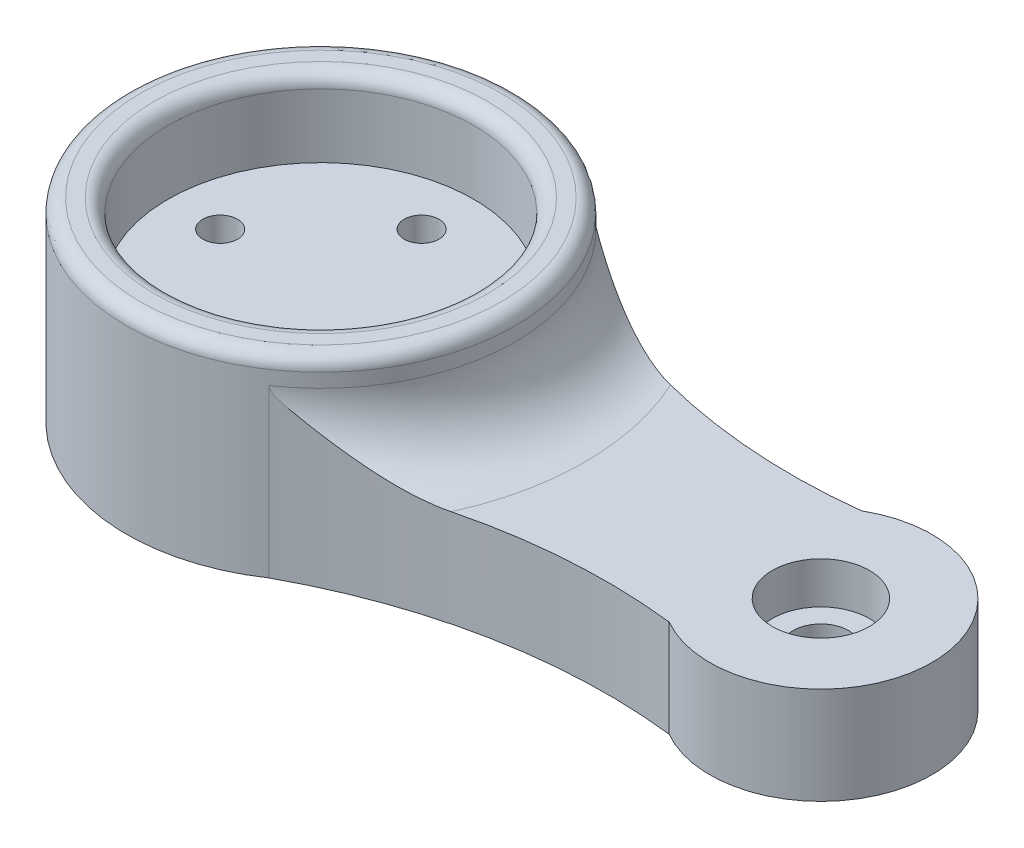
ISO-10303-21;
HEADER;
FILE_DESCRIPTION(('STEP AP214'),'2;1');
FILE_NAME('part.step','',(''),(''),'','','');
FILE_SCHEMA(('AUTOMOTIVE_DESIGN { 1 0 10303 214 1 1 1 1 }'));
ENDSEC;
DATA;
#1=APPLICATION_CONTEXT('core data for automotive mechanical design processes');
#2=APPLICATION_PROTOCOL_DEFINITION('international standard','automotive_design',2000,#1);
#3=PRODUCT_CONTEXT('',#1,'mechanical');
#4=PRODUCT('Part','Part','',(#3));
#5=PRODUCT_RELATED_PRODUCT_CATEGORY('part','',(#4));
#6=PRODUCT_DEFINITION_FORMATION('','',#4);
#7=PRODUCT_DEFINITION_CONTEXT('part definition',#1,'design');
#8=PRODUCT_DEFINITION('design','',#6,#7);
#9=PRODUCT_DEFINITION_SHAPE('','',#8);
#10=(LENGTH_UNIT() NAMED_UNIT(*) SI_UNIT(.MILLI.,.METRE.));
#11=(NAMED_UNIT(*) PLANE_ANGLE_UNIT() SI_UNIT($,.RADIAN.));
#12=(NAMED_UNIT(*) SI_UNIT($,.STERADIAN.) SOLID_ANGLE_UNIT());
#13=UNCERTAINTY_MEASURE_WITH_UNIT(LENGTH_MEASURE(1.E-05),#10,'distance_accuracy_value','');
#14=(GEOMETRIC_REPRESENTATION_CONTEXT(3) GLOBAL_UNCERTAINTY_ASSIGNED_CONTEXT((#13)) GLOBAL_UNIT_ASSIGNED_CONTEXT((#10,
#11,#12)) REPRESENTATION_CONTEXT('',''));
#15=CARTESIAN_POINT('',(0.,0.,0.));
#16=DIRECTION('',(0.,0.,1.));
#17=DIRECTION('',(1.,0.,0.));
#18=AXIS2_PLACEMENT_3D('',#15,#16,#17);
#19=CARTESIAN_POINT('',(36.,7.,0.));
#20=DIRECTION('',(0.,-1.,0.));
#21=DIRECTION('',(0.,0.,-1.));
#22=AXIS2_PLACEMENT_3D('',#19,#20,#21);
#23=CYLINDRICAL_SURFACE('',#22,2.);
#24=CARTESIAN_POINT('',(36.,0.,0.));
#25=DIRECTION('',(0.,1.,0.));
#26=DIRECTION('',(0.,0.,1.));
#27=AXIS2_PLACEMENT_3D('',#24,#25,#26);
#28=CIRCLE('',#27,2.);
#29=CARTESIAN_POINT('',(36.,0.,2.));
#30=VERTEX_POINT('',#29);
#31=EDGE_CURVE('E254',#30,#30,#28,.T.);
#32=ORIENTED_EDGE('',*,*,#31,.F.);
#33=EDGE_LOOP('',(#32));
#34=FACE_BOUND('',#33,.T.);
#35=CARTESIAN_POINT('',(36.,4.,0.));
#36=DIRECTION('',(0.,1.,0.));
#37=DIRECTION('',(0.,0.,1.));
#38=AXIS2_PLACEMENT_3D('',#35,#36,#37);
#39=CIRCLE('',#38,2.);
#40=CARTESIAN_POINT('',(36.,4.,2.));
#41=VERTEX_POINT('',#40);
#42=EDGE_CURVE('E42',#41,#41,#39,.T.);
#43=ORIENTED_EDGE('',*,*,#42,.T.);
#44=EDGE_LOOP('',(#43));
#45=FACE_BOUND('',#44,.T.);
#46=ADVANCED_FACE('F38',(#34,#45),#23,.F.);
#47=CARTESIAN_POINT('',(0.,14.,0.));
#48=DIRECTION('',(0.,-1.,0.));
#49=DIRECTION('',(0.,0.,-1.));
#50=AXIS2_PLACEMENT_3D('',#47,#48,#49);
#51=CYLINDRICAL_SURFACE('',#50,14.);
#52=CARTESIAN_POINT('',(0.,13.,0.));
#53=DIRECTION('',(0.,1.,0.));
#54=DIRECTION('',(0.,0.,1.));
#55=AXIS2_PLACEMENT_3D('',#52,#53,#54);
#56=CIRCLE('',#55,14.);
#57=CARTESIAN_POINT('',(0.,13.,14.));
#58=VERTEX_POINT('',#57);
#59=EDGE_CURVE('E11',#58,#58,#56,.F.);
#60=ORIENTED_EDGE('',*,*,#59,.T.);
#61=EDGE_LOOP('',(#60));
#62=FACE_BOUND('',#61,.T.);
#63=CARTESIAN_POINT('',(0.,12.,0.));
#64=DIRECTION('',(0.,1.,0.));
#65=DIRECTION('',(0.,0.,1.));
#66=AXIS2_PLACEMENT_3D('',#63,#64,#65);
#67=CIRCLE('',#66,14.);
#68=CARTESIAN_POINT('',(7.84985565433126,12.,11.592228698838));
#69=VERTEX_POINT('',#68);
#70=CARTESIAN_POINT('',(7.84985565433126,12.,-11.592228698838));
#71=VERTEX_POINT('',#70);
#72=EDGE_CURVE('E107',#69,#71,#67,.T.);
#73=ORIENTED_EDGE('',*,*,#72,.T.);
#74=DIRECTION('',(0.,-1.,0.));
#75=VECTOR('',#74,1.);
#76=CARTESIAN_POINT('',(7.84985565433126,7.,-11.592228698838));
#77=LINE('',#76,#75);
#78=CARTESIAN_POINT('',(7.84985565433126,0.,-11.592228698838));
#79=VERTEX_POINT('',#78);
#80=EDGE_CURVE('E105',#71,#79,#77,.T.);
#81=ORIENTED_EDGE('',*,*,#80,.T.);
#82=CARTESIAN_POINT('',(0.,0.,0.));
#83=DIRECTION('',(0.,1.,0.));
#84=DIRECTION('',(0.,0.,1.));
#85=AXIS2_PLACEMENT_3D('',#82,#83,#84);
#86=CIRCLE('',#85,14.);
#87=CARTESIAN_POINT('',(7.84985565433126,0.,11.592228698838));
#88=VERTEX_POINT('',#87);
#89=EDGE_CURVE('E104',#79,#88,#86,.T.);
#90=ORIENTED_EDGE('',*,*,#89,.T.);
#91=DIRECTION('',(0.,-1.,0.));
#92=VECTOR('',#91,1.);
#93=CARTESIAN_POINT('',(7.84985565433126,7.,11.592228698838));
#94=LINE('',#93,#92);
#95=EDGE_CURVE('E110',#69,#88,#94,.T.);
#96=ORIENTED_EDGE('',*,*,#95,.F.);
#97=EDGE_LOOP('',(#73,#81,#90,#96));
#98=FACE_BOUND('',#97,.T.);
#99=ADVANCED_FACE('F145',(#62,#98),#51,.T.);
#100=CARTESIAN_POINT('',(0.,14.,0.));
#101=DIRECTION('',(0.,1.,0.));
#102=DIRECTION('',(0.,0.,1.));
#103=AXIS2_PLACEMENT_3D('',#100,#101,#102);
#104=PLANE('',#103);
#105=CARTESIAN_POINT('',(0.,14.,0.));
#106=DIRECTION('',(0.,1.,0.));
#107=DIRECTION('',(0.,0.,1.));
#108=AXIS2_PLACEMENT_3D('',#105,#106,#107);
#109=CIRCLE('',#108,12.);
#110=CARTESIAN_POINT('',(0.,14.,12.));
#111=VERTEX_POINT('',#110);
#112=EDGE_CURVE('E47',#111,#111,#109,.F.);
#113=ORIENTED_EDGE('',*,*,#112,.T.);
#114=EDGE_LOOP('',(#113));
#115=FACE_BOUND('',#114,.T.);
#116=CARTESIAN_POINT('',(0.,14.,0.));
#117=DIRECTION('',(0.,1.,0.));
#118=DIRECTION('',(0.,0.,1.));
#119=AXIS2_PLACEMENT_3D('',#116,#117,#118);
#120=CIRCLE('',#119,13.);
#121=CARTESIAN_POINT('',(0.,14.,13.));
#122=VERTEX_POINT('',#121);
#123=EDGE_CURVE('E167',#122,#122,#120,.T.);
#124=ORIENTED_EDGE('',*,*,#123,.T.);
#125=EDGE_LOOP('',(#124));
#126=FACE_BOUND('',#125,.T.);
#127=ADVANCED_FACE('F147',(#115,#126),#104,.T.);
#128=CARTESIAN_POINT('',(0.,0.,0.));
#129=DIRECTION('',(0.,1.,0.));
#130=DIRECTION('',(0.,0.,1.));
#131=AXIS2_PLACEMENT_3D('',#128,#129,#130);
#132=PLANE('',#131);
#133=CARTESIAN_POINT('',(0.,0.,-7.25));
#134=DIRECTION('',(0.,1.,0.));
#135=DIRECTION('',(0.,0.,1.));
#136=AXIS2_PLACEMENT_3D('',#133,#134,#135);
#137=CIRCLE('',#136,1.25);
#138=CARTESIAN_POINT('',(0.,0.,-6.));
#139=VERTEX_POINT('',#138);
#140=EDGE_CURVE('E249',#139,#139,#137,.T.);
#141=ORIENTED_EDGE('',*,*,#140,.T.);
#142=EDGE_LOOP('',(#141));
#143=FACE_BOUND('',#142,.T.);
#144=CARTESIAN_POINT('',(7.2500000000002,0.,-2.04725589976356E-13));
#145=DIRECTION('',(0.,1.,0.));
#146=DIRECTION('',(0.,0.,1.));
#147=AXIS2_PLACEMENT_3D('',#144,#145,#146);
#148=CIRCLE('',#147,1.25000000000016);
#149=CARTESIAN_POINT('',(7.2500000000002,0.,1.24999999999996));
#150=VERTEX_POINT('',#149);
#151=EDGE_CURVE('E246',#150,#150,#148,.T.);
#152=ORIENTED_EDGE('',*,*,#151,.T.);
#153=EDGE_LOOP('',(#152));
#154=FACE_BOUND('',#153,.T.);
#155=CARTESIAN_POINT('',(4.09451179952713E-13,0.,7.25));
#156=DIRECTION('',(0.,1.,0.));
#157=DIRECTION('',(0.,0.,1.));
#158=AXIS2_PLACEMENT_3D('',#155,#156,#157);
#159=CIRCLE('',#158,1.25000000000044);
#160=CARTESIAN_POINT('',(4.09451179952713E-13,0.,8.50000000000044));
#161=VERTEX_POINT('',#160);
#162=EDGE_CURVE('E243',#161,#161,#159,.T.);
#163=ORIENTED_EDGE('',*,*,#162,.T.);
#164=EDGE_LOOP('',(#163));
#165=FACE_BOUND('',#164,.T.);
#166=CARTESIAN_POINT('',(-7.2499999999998,0.,2.05613458905738E-13));
#167=DIRECTION('',(0.,1.,0.));
#168=DIRECTION('',(0.,0.,1.));
#169=AXIS2_PLACEMENT_3D('',#166,#167,#168);
#170=CIRCLE('',#169,1.25000000000033);
#171=CARTESIAN_POINT('',(-7.2499999999998,0.,1.25000000000054));
#172=VERTEX_POINT('',#171);
#173=EDGE_CURVE('E231',#172,#172,#170,.T.);
#174=ORIENTED_EDGE('',*,*,#173,.T.);
#175=EDGE_LOOP('',(#174));
#176=FACE_BOUND('',#175,.T.);
#177=ORIENTED_EDGE('',*,*,#89,.F.);
#178=CARTESIAN_POINT('',(27.2681035881496,0.,-47.2917340375686));
#179=DIRECTION('',(0.,1.,0.));
#180=DIRECTION('',(0.,0.,1.));
#181=AXIS2_PLACEMENT_3D('',#178,#179,#180);
#182=CIRCLE('',#181,40.6389349546626);
#183=CARTESIAN_POINT('',(32.0022203720833,0.,-6.92948468838873));
#184=VERTEX_POINT('',#183);
#185=EDGE_CURVE('E261',#79,#184,#182,.T.);
#186=ORIENTED_EDGE('',*,*,#185,.T.);
#187=CARTESIAN_POINT('',(36.,0.,0.));
#188=DIRECTION('',(0.,1.,0.));
#189=DIRECTION('',(0.,0.,1.));
#190=AXIS2_PLACEMENT_3D('',#187,#188,#189);
#191=CIRCLE('',#190,8.);
#192=CARTESIAN_POINT('',(32.0022203720833,0.,6.92948468838873));
#193=VERTEX_POINT('',#192);
#194=EDGE_CURVE('E102',#193,#184,#191,.T.);
#195=ORIENTED_EDGE('',*,*,#194,.F.);
#196=CARTESIAN_POINT('',(27.2681035881496,0.,47.2917340375686));
#197=DIRECTION('',(0.,1.,0.));
#198=DIRECTION('',(0.,0.,1.));
#199=AXIS2_PLACEMENT_3D('',#196,#197,#198);
#200=CIRCLE('',#199,40.6389349546626);
#201=EDGE_CURVE('E98',#88,#193,#200,.F.);
#202=ORIENTED_EDGE('',*,*,#201,.F.);
#203=EDGE_LOOP('',(#177,#186,#195,#202));
#204=FACE_BOUND('',#203,.T.);
#205=ORIENTED_EDGE('',*,*,#31,.T.);
#206=EDGE_LOOP('',(#205));
#207=FACE_BOUND('',#206,.T.);
#208=ADVANCED_FACE('F142',(#143,#154,#165,#176,#204,#207),#132,.F.);
#209=CARTESIAN_POINT('',(36.,7.,0.));
#210=DIRECTION('',(0.,-1.,0.));
#211=DIRECTION('',(0.,0.,-1.));
#212=AXIS2_PLACEMENT_3D('',#209,#210,#211);
#213=CYLINDRICAL_SURFACE('',#212,8.);
#214=ORIENTED_EDGE('',*,*,#194,.T.);
#215=DIRECTION('',(0.,-1.,0.));
#216=VECTOR('',#215,1.);
#217=CARTESIAN_POINT('',(32.0022203720833,7.,-6.92948468838873));
#218=LINE('',#217,#216);
#219=CARTESIAN_POINT('',(32.0022203720833,7.,-6.92948468838873));
#220=VERTEX_POINT('',#219);
#221=EDGE_CURVE('E88',#220,#184,#218,.T.);
#222=ORIENTED_EDGE('',*,*,#221,.F.);
#223=CARTESIAN_POINT('',(36.,7.,0.));
#224=DIRECTION('',(0.,1.,0.));
#225=DIRECTION('',(0.,0.,1.));
#226=AXIS2_PLACEMENT_3D('',#223,#224,#225);
#227=CIRCLE('',#226,8.);
#228=CARTESIAN_POINT('',(32.0022203720833,7.,6.92948468838873));
#229=VERTEX_POINT('',#228);
#230=EDGE_CURVE('E91',#229,#220,#227,.T.);
#231=ORIENTED_EDGE('',*,*,#230,.F.);
#232=DIRECTION('',(0.,-1.,0.));
#233=VECTOR('',#232,1.);
#234=CARTESIAN_POINT('',(32.0022203720833,7.,6.92948468838873));
#235=LINE('',#234,#233);
#236=EDGE_CURVE('E257',#229,#193,#235,.T.);
#237=ORIENTED_EDGE('',*,*,#236,.T.);
#238=EDGE_LOOP('',(#214,#222,#231,#237));
#239=FACE_BOUND('',#238,.T.);
#240=ADVANCED_FACE('F100',(#239),#213,.T.);
#241=CARTESIAN_POINT('',(27.2681035881496,7.,-47.2917340375686));
#242=DIRECTION('',(0.,-1.,0.));
#243=DIRECTION('',(0.,0.,-1.));
#244=AXIS2_PLACEMENT_3D('',#241,#242,#243);
#245=CYLINDRICAL_SURFACE('',#244,40.6389349546626);
#246=ORIENTED_EDGE('',*,*,#185,.F.);
#247=ORIENTED_EDGE('',*,*,#80,.F.);
#248=CARTESIAN_POINT('',(7.84985565433126,12.,-11.592228698838));
#249=CARTESIAN_POINT('',(7.84974022861477,11.9679309176719,-11.5922925865803));
#250=CARTESIAN_POINT('',(7.85265054969314,11.9360773456577,-11.5907083390197));
#251=CARTESIAN_POINT('',(7.86332220076886,11.8740872266933,-11.5849062790627));
#252=CARTESIAN_POINT('',(7.87098266918817,11.8439288512946,-11.5807432252193));
#253=CARTESIAN_POINT('',(7.89484307359123,11.7704549373273,-11.5677916777738));
#254=CARTESIAN_POINT('',(7.91340111185751,11.7281708444863,-11.5577293964526));
#255=CARTESIAN_POINT('',(7.95572152866589,11.6466654603166,-11.5348391802298));
#256=CARTESIAN_POINT('',(7.97954143458571,11.6074850946165,-11.5219807011542));
#257=CARTESIAN_POINT('',(8.05078578916995,11.5009485890175,-11.4836286680165));
#258=CARTESIAN_POINT('',(8.1016505101103,11.436596646532,-11.4563651363081));
#259=CARTESIAN_POINT('',(8.20794625276915,11.3127109121178,-11.3997135139125));
#260=CARTESIAN_POINT('',(8.26339078654471,11.2531924852263,-11.3703191702495));
#261=CARTESIAN_POINT('',(8.37706841297851,11.1370657583194,-11.3104061040382));
#262=CARTESIAN_POINT('',(8.4353096295304,11.0804670680134,-11.2798841737002));
#263=CARTESIAN_POINT('',(8.55339242705564,10.9694673058596,-11.2183774007257));
#264=CARTESIAN_POINT('',(8.61323140460291,10.9150629830675,-11.1873933435915));
#265=CARTESIAN_POINT('',(8.793278481255,10.755242319462,-11.0947462006986));
#266=CARTESIAN_POINT('',(8.91524942267105,10.652015252016,-11.032737554919));
#267=CARTESIAN_POINT('',(9.16231003071952,10.4493353410656,-10.9087375461931));
#268=CARTESIAN_POINT('',(9.28740039371779,10.3498833530194,-10.8467461902869));
#269=CARTESIAN_POINT('',(9.54029337011726,10.1539261092309,-10.7230642111642));
#270=CARTESIAN_POINT('',(9.66809907229333,10.0574245515463,-10.6613740407446));
#271=CARTESIAN_POINT('',(9.92602875230379,9.86724225930931,-10.538558908456));
#272=CARTESIAN_POINT('',(10.0561524946845,9.77356124083322,-10.4774338901292));
#273=CARTESIAN_POINT('',(10.4495008074444,9.49697197712343,-10.2952332338723));
#274=CARTESIAN_POINT('',(10.7161122094876,9.31820120129215,-10.175131199454));
#275=CARTESIAN_POINT('',(11.2583978026474,8.973147762316,-9.93802054242334));
#276=CARTESIAN_POINT('',(11.5340665551478,8.80685779503413,-9.82101013689485));
#277=CARTESIAN_POINT('',(12.0975081176459,8.48774853292849,-9.58935215669122));
#278=CARTESIAN_POINT('',(12.3853618792861,8.33505138023552,-9.47473195758891));
#279=CARTESIAN_POINT('',(12.9716359201195,8.04782479631386,-9.24922203298971));
#280=CARTESIAN_POINT('',(13.2700601117094,7.91330218255468,-9.13833371901126));
#281=CARTESIAN_POINT('',(13.8762341585524,7.66695410840608,-8.92138111237948));
#282=CARTESIAN_POINT('',(14.1839370982046,7.55503119561138,-8.81529770697784));
#283=CARTESIAN_POINT('',(14.8092942634841,7.35780614680489,-8.60828102437342));
#284=CARTESIAN_POINT('',(15.1269409984889,7.27248447905179,-8.50734401423981));
#285=CARTESIAN_POINT('',(15.7473566801688,7.13877404852054,-8.31876525413785));
#286=CARTESIAN_POINT('',(16.049492881318,7.08812381790483,-8.23069209555604));
#287=CARTESIAN_POINT('',(16.6605986056181,7.01867776177677,-8.06029343574112));
#288=CARTESIAN_POINT('',(16.9695950600419,7.00004519317896,-7.97799943202157));
#289=CARTESIAN_POINT('',(17.280067100755,7.,-7.89932155272873));
#290=B_SPLINE_CURVE_WITH_KNOTS('',3,(#248,#249,#250,#251,#252,#253,#254,#255,#256,#257,#258,
#259,#260,#261,#262,#263,#264,#265,#266,#267,#268,#269,#270,#271,#272,#273,#274,#275,#276,#277,
#278,#279,#280,#281,#282,#283,#284,#285,#286,#287,#288,#289),.UNSPECIFIED.,.F.,.F.,(4,2,2,2,2,2,
2,2,2,2,2,2,2,2,2,2,2,2,2,2,4),(0.,0.0956940712966536,0.189422701596269,0.330401138202287,
0.473004715475644,0.731601544597679,0.99099061924358,1.25118509277208,1.5109787586279,
2.02504819054163,2.53923342691654,3.05403871454739,3.56879200594802,4.59663422428038,
5.62387015127668,6.65956119297143,7.6956396614654,8.72715026811531,9.75790170331909,
10.7125617105111,11.6720752079897),.UNSPECIFIED.);
#291=CARTESIAN_POINT('',(17.280067100755,7.,-7.89932155272873));
#292=VERTEX_POINT('',#291);
#293=EDGE_CURVE('E62',#71,#292,#290,.T.);
#294=ORIENTED_EDGE('',*,*,#293,.T.);
#295=CARTESIAN_POINT('',(27.2681035881496,7.,-47.2917340375686));
#296=DIRECTION('',(0.,1.,0.));
#297=DIRECTION('',(0.,0.,1.));
#298=AXIS2_PLACEMENT_3D('',#295,#296,#297);
#299=CIRCLE('',#298,40.6389349546626);
#300=EDGE_CURVE('E83',#292,#220,#299,.T.);
#301=ORIENTED_EDGE('',*,*,#300,.T.);
#302=ORIENTED_EDGE('',*,*,#221,.T.);
#303=EDGE_LOOP('',(#246,#247,#294,#301,#302));
#304=FACE_BOUND('',#303,.T.);
#305=ADVANCED_FACE('F86',(#304),#245,.F.);
#306=CARTESIAN_POINT('',(27.2681035881496,7.,47.2917340375686));
#307=DIRECTION('',(0.,-1.,0.));
#308=DIRECTION('',(0.,0.,-1.));
#309=AXIS2_PLACEMENT_3D('',#306,#307,#308);
#310=CYLINDRICAL_SURFACE('',#309,40.6389349546626);
#311=ORIENTED_EDGE('',*,*,#201,.T.);
#312=ORIENTED_EDGE('',*,*,#236,.F.);
#313=CARTESIAN_POINT('',(27.2681035881496,7.,47.2917340375686));
#314=DIRECTION('',(0.,1.,0.));
#315=DIRECTION('',(0.,0.,1.));
#316=AXIS2_PLACEMENT_3D('',#313,#314,#315);
#317=CIRCLE('',#316,40.6389349546626);
#318=CARTESIAN_POINT('',(17.280067100755,7.,7.89932155272873));
#319=VERTEX_POINT('',#318);
#320=EDGE_CURVE('E90',#319,#229,#317,.F.);
#321=ORIENTED_EDGE('',*,*,#320,.F.);
#322=CARTESIAN_POINT('',(17.280067100755,7.,7.89932155272873));
#323=CARTESIAN_POINT('',(17.0174684213055,7.0000181662928,7.96587945108746));
#324=CARTESIAN_POINT('',(16.7558203697529,7.01336673860963,8.0350388996193));
#325=CARTESIAN_POINT('',(16.2365900200022,7.06371356097446,8.17779079874259));
#326=CARTESIAN_POINT('',(15.9790002906786,7.10066171247149,8.25137356022765));
#327=CARTESIAN_POINT('',(15.4716270059155,7.19472105117239,8.40168875069373));
#328=CARTESIAN_POINT('',(15.2217896718571,7.25161457318647,8.47837957365822));
#329=CARTESIAN_POINT('',(14.7277718387462,7.38305851346483,8.6351653576078));
#330=CARTESIAN_POINT('',(14.4835950471418,7.45762016393798,8.7152624573864));
#331=CARTESIAN_POINT('',(13.8330770606024,7.67942347721404,8.93537976543369));
#332=CARTESIAN_POINT('',(13.4325719261037,7.84105799476147,9.07818440882779));
#333=CARTESIAN_POINT('',(12.6497373326556,8.19850263102909,9.37074596706712));
#334=CARTESIAN_POINT('',(12.2674211583646,8.39433725528567,9.52050781011794));
#335=CARTESIAN_POINT('',(11.7060154212405,8.70846296897013,9.74994973724382));
#336=CARTESIAN_POINT('',(11.5204029573492,8.81689034940267,9.82744779724331));
#337=CARTESIAN_POINT('',(11.1533853966746,9.03969281841592,9.98384360908571));
#338=CARTESIAN_POINT('',(10.9719801619727,9.15406771162969,10.0627413148963));
#339=CARTESIAN_POINT('',(10.6133253523219,9.38809696967035,10.2218020259717));
#340=CARTESIAN_POINT('',(10.4360738505015,9.50774880924323,10.3019644144826));
#341=CARTESIAN_POINT('',(10.0855786863905,9.75199866470023,10.463469213148));
#342=CARTESIAN_POINT('',(9.91233477132722,9.87659636727762,10.5448115483498));
#343=CARTESIAN_POINT('',(9.59794489637832,10.1100404445101,10.6950985460404));
#344=CARTESIAN_POINT('',(9.45617462657944,10.2181390171632,10.7639001005864));
#345=CARTESIAN_POINT('',(9.17629508509291,10.4379726154743,10.9017116330813));
#346=CARTESIAN_POINT('',(9.03817678538744,10.5496967757575,10.9707205109406));
#347=CARTESIAN_POINT('',(8.81612679514069,10.736598767069,11.0832142388125));
#348=CARTESIAN_POINT('',(8.73088882574537,10.8101630618612,11.1267838164661));
#349=CARTESIAN_POINT('',(8.56256207501011,10.9606687856993,11.2135583420112));
#350=CARTESIAN_POINT('',(8.47948319692822,11.0376224897469,11.2567611486962));
#351=CARTESIAN_POINT('',(8.31659622191047,11.1970536763272,11.3421607183105));
#352=CARTESIAN_POINT('',(8.23681805504419,11.2795689568296,11.3843472395597));
#353=CARTESIAN_POINT('',(8.12394153504192,11.410396225039,11.4444756365264));
#354=CARTESIAN_POINT('',(8.08751283821482,11.4550862602229,11.4639579620724));
#355=CARTESIAN_POINT('',(8.01845376533322,11.5480000214613,11.5010156673316));
#356=CARTESIAN_POINT('',(7.98581311360491,11.5962135807052,11.5185961967254));
#357=CARTESIAN_POINT('',(7.93884254137544,11.678074597348,11.5439631851053));
#358=CARTESIAN_POINT('',(7.92233163674018,11.7100838906451,11.5528977680977));
#359=CARTESIAN_POINT('',(7.89335631489633,11.7762193985695,11.5685977060913));
#360=CARTESIAN_POINT('',(7.88086515918084,11.8103297474664,11.5753773911299));
#361=CARTESIAN_POINT('',(7.8644631118189,11.8703032953228,11.5842861338451));
#362=CARTESIAN_POINT('',(7.85910930370444,11.8956427524995,11.5871964694578));
#363=CARTESIAN_POINT('',(7.8517504214794,11.9472848447118,11.591198032342));
#364=CARTESIAN_POINT('',(7.84979194125363,11.973595896944,11.5922639483818));
#365=CARTESIAN_POINT('',(7.84985565433125,12.,11.592228698838));
#366=B_SPLINE_CURVE_WITH_KNOTS('',3,(#322,#323,#324,#325,#326,#327,#328,#329,#330,#331,#332,
#333,#334,#335,#336,#337,#338,#339,#340,#341,#342,#343,#344,#345,#346,#347,#348,#349,#350,#351,
#352,#353,#354,#355,#356,#357,#358,#359,#360,#361,#362,#363,#364,#365),.UNSPECIFIED.,.F.,.F.,(4,
2,2,2,2,2,2,2,2,2,2,2,2,2,2,2,2,2,2,2,2,4),(0.,0.811958707503267,1.62219944515059,
2.42385992770422,3.22603142593327,4.58840085741852,5.95175050834504,6.63716710322882,
7.32256119740244,8.00763078532036,8.69265704501786,9.26589104392878,9.83754219758415,
10.1996740603956,10.5632471165878,10.9296052370512,11.1120679655854,11.2940235554311,
11.4051298476166,11.5154810281657,11.5933885715482,11.6723570144176),.UNSPECIFIED.);
#367=EDGE_CURVE('E124',#319,#69,#366,.T.);
#368=ORIENTED_EDGE('',*,*,#367,.T.);
#369=ORIENTED_EDGE('',*,*,#95,.T.);
#370=EDGE_LOOP('',(#311,#312,#321,#368,#369));
#371=FACE_BOUND('',#370,.T.);
#372=ADVANCED_FACE('F137',(#371),#310,.F.);
#373=CARTESIAN_POINT('',(0.,7.,0.));
#374=DIRECTION('',(0.,1.,0.));
#375=DIRECTION('',(0.,0.,1.));
#376=AXIS2_PLACEMENT_3D('',#373,#374,#375);
#377=PLANE('',#376);
#378=CARTESIAN_POINT('',(36.,7.,0.));
#379=DIRECTION('',(0.,1.,0.));
#380=DIRECTION('',(0.,0.,1.));
#381=AXIS2_PLACEMENT_3D('',#378,#379,#380);
#382=CIRCLE('',#381,3.50000000000001);
#383=CARTESIAN_POINT('',(36.,7.,3.50000000000001));
#384=VERTEX_POINT('',#383);
#385=EDGE_CURVE('E222',#384,#384,#382,.T.);
#386=ORIENTED_EDGE('',*,*,#385,.F.);
#387=EDGE_LOOP('',(#386));
#388=FACE_BOUND('',#387,.T.);
#389=ORIENTED_EDGE('',*,*,#300,.F.);
#390=CARTESIAN_POINT('',(0.,7.,0.));
#391=DIRECTION('',(0.,1.,0.));
#392=DIRECTION('',(0.,0.,1.));
#393=AXIS2_PLACEMENT_3D('',#390,#391,#392);
#394=CIRCLE('',#393,19.);
#395=EDGE_CURVE('E54',#292,#319,#394,.F.);
#396=ORIENTED_EDGE('',*,*,#395,.T.);
#397=ORIENTED_EDGE('',*,*,#320,.T.);
#398=ORIENTED_EDGE('',*,*,#230,.T.);
#399=EDGE_LOOP('',(#389,#396,#397,#398));
#400=FACE_BOUND('',#399,.T.);
#401=ADVANCED_FACE('F94',(#388,#400),#377,.T.);
#402=CARTESIAN_POINT('',(0.,12.,0.));
#403=DIRECTION('',(0.,1.,0.));
#404=DIRECTION('',(0.,0.,1.));
#405=AXIS2_PLACEMENT_3D('',#402,#403,#404);
#406=TOROIDAL_SURFACE('',#405,19.,5.);
#407=ORIENTED_EDGE('',*,*,#367,.F.);
#408=ORIENTED_EDGE('',*,*,#395,.F.);
#409=ORIENTED_EDGE('',*,*,#293,.F.);
#410=ORIENTED_EDGE('',*,*,#72,.F.);
#411=EDGE_LOOP('',(#407,#408,#409,#410));
#412=FACE_BOUND('',#411,.T.);
#413=ADVANCED_FACE('F131',(#412),#406,.F.);
#414=CARTESIAN_POINT('',(0.,8.4,0.));
#415=DIRECTION('',(0.,1.,0.));
#416=DIRECTION('',(0.,0.,1.));
#417=AXIS2_PLACEMENT_3D('',#414,#415,#416);
#418=CYLINDRICAL_SURFACE('',#417,11.);
#419=CARTESIAN_POINT('',(0.,13.,0.));
#420=DIRECTION('',(0.,1.,0.));
#421=DIRECTION('',(0.,0.,1.));
#422=AXIS2_PLACEMENT_3D('',#419,#420,#421);
#423=CIRCLE('',#422,11.);
#424=CARTESIAN_POINT('',(0.,13.,11.));
#425=VERTEX_POINT('',#424);
#426=EDGE_CURVE('E165',#425,#425,#423,.T.);
#427=ORIENTED_EDGE('',*,*,#426,.T.);
#428=EDGE_LOOP('',(#427));
#429=FACE_BOUND('',#428,.T.);
#430=CARTESIAN_POINT('',(0.,8.4,0.));
#431=DIRECTION('',(0.,1.,0.));
#432=DIRECTION('',(0.,0.,1.));
#433=AXIS2_PLACEMENT_3D('',#430,#431,#432);
#434=CIRCLE('',#433,11.);
#435=CARTESIAN_POINT('',(0.,8.4,11.));
#436=VERTEX_POINT('',#435);
#437=EDGE_CURVE('E252',#436,#436,#434,.T.);
#438=ORIENTED_EDGE('',*,*,#437,.F.);
#439=EDGE_LOOP('',(#438));
#440=FACE_BOUND('',#439,.T.);
#441=ADVANCED_FACE('F211',(#429,#440),#418,.F.);
#442=CARTESIAN_POINT('',(0.,8.4,0.));
#443=DIRECTION('',(0.,1.,0.));
#444=DIRECTION('',(0.,0.,1.));
#445=AXIS2_PLACEMENT_3D('',#442,#443,#444);
#446=PLANE('',#445);
#447=CARTESIAN_POINT('',(0.,8.4,-7.25));
#448=DIRECTION('',(0.,1.,0.));
#449=DIRECTION('',(0.,0.,1.));
#450=AXIS2_PLACEMENT_3D('',#447,#448,#449);
#451=CIRCLE('',#450,1.25);
#452=CARTESIAN_POINT('',(0.,8.4,-6.));
#453=VERTEX_POINT('',#452);
#454=EDGE_CURVE('E229',#453,#453,#451,.T.);
#455=ORIENTED_EDGE('',*,*,#454,.F.);
#456=EDGE_LOOP('',(#455));
#457=FACE_BOUND('',#456,.T.);
#458=CARTESIAN_POINT('',(7.2500000000002,8.4,-2.04725589976356E-13));
#459=DIRECTION('',(0.,1.,0.));
#460=DIRECTION('',(0.,0.,1.));
#461=AXIS2_PLACEMENT_3D('',#458,#459,#460);
#462=CIRCLE('',#461,1.25000000000016);
#463=CARTESIAN_POINT('',(7.2500000000002,8.4,1.24999999999996));
#464=VERTEX_POINT('',#463);
#465=EDGE_CURVE('E232',#464,#464,#462,.T.);
#466=ORIENTED_EDGE('',*,*,#465,.F.);
#467=EDGE_LOOP('',(#466));
#468=FACE_BOUND('',#467,.T.);
#469=CARTESIAN_POINT('',(4.09451179952713E-13,8.4,7.25));
#470=DIRECTION('',(0.,1.,0.));
#471=DIRECTION('',(0.,0.,1.));
#472=AXIS2_PLACEMENT_3D('',#469,#470,#471);
#473=CIRCLE('',#472,1.25000000000044);
#474=CARTESIAN_POINT('',(4.09451179952713E-13,8.4,8.50000000000044));
#475=VERTEX_POINT('',#474);
#476=EDGE_CURVE('E235',#475,#475,#473,.T.);
#477=ORIENTED_EDGE('',*,*,#476,.F.);
#478=EDGE_LOOP('',(#477));
#479=FACE_BOUND('',#478,.T.);
#480=CARTESIAN_POINT('',(-7.2499999999998,8.4,2.05613458905738E-13));
#481=DIRECTION('',(0.,1.,0.));
#482=DIRECTION('',(0.,0.,1.));
#483=AXIS2_PLACEMENT_3D('',#480,#481,#482);
#484=CIRCLE('',#483,1.25000000000033);
#485=CARTESIAN_POINT('',(-7.2499999999998,8.4,1.25000000000054));
#486=VERTEX_POINT('',#485);
#487=EDGE_CURVE('E238',#486,#486,#484,.T.);
#488=ORIENTED_EDGE('',*,*,#487,.F.);
#489=EDGE_LOOP('',(#488));
#490=FACE_BOUND('',#489,.T.);
#491=ORIENTED_EDGE('',*,*,#437,.T.);
#492=EDGE_LOOP('',(#491));
#493=FACE_BOUND('',#492,.T.);
#494=ADVANCED_FACE('F207',(#457,#468,#479,#490,#493),#446,.T.);
#495=CARTESIAN_POINT('',(-7.2499999999998,-6.2,2.05613458905738E-13));
#496=DIRECTION('',(0.,1.,0.));
#497=DIRECTION('',(0.,0.,1.));
#498=AXIS2_PLACEMENT_3D('',#495,#496,#497);
#499=CYLINDRICAL_SURFACE('',#498,1.25000000000033);
#500=CARTESIAN_POINT('',(-7.2499999999998,8.4,1.25000000000054));
#501=CARTESIAN_POINT('',(-7.2499999999998,8.3125,1.25000000000054));
#502=CARTESIAN_POINT('',(-7.2499999999998,8.225,1.25000000000054));
#503=CARTESIAN_POINT('',(-7.2499999999998,8.05,1.25000000000054));
#504=CARTESIAN_POINT('',(-7.2499999999998,7.9625,1.25000000000054));
#505=CARTESIAN_POINT('',(-7.2499999999998,7.7875,1.25000000000054));
#506=CARTESIAN_POINT('',(-7.2499999999998,7.7,1.25000000000054));
#507=CARTESIAN_POINT('',(-7.2499999999998,7.525,1.25000000000054));
#508=CARTESIAN_POINT('',(-7.2499999999998,7.4375,1.25000000000054));
#509=CARTESIAN_POINT('',(-7.2499999999998,7.2625,1.25000000000054));
#510=CARTESIAN_POINT('',(-7.2499999999998,7.175,1.25000000000054));
#511=CARTESIAN_POINT('',(-7.2499999999998,7.,1.25000000000054));
#512=CARTESIAN_POINT('',(-7.2499999999998,6.9125,1.25000000000054));
#513=CARTESIAN_POINT('',(-7.2499999999998,6.7375,1.25000000000054));
#514=CARTESIAN_POINT('',(-7.2499999999998,6.65,1.25000000000054));
#515=CARTESIAN_POINT('',(-7.2499999999998,6.475,1.25000000000054));
#516=CARTESIAN_POINT('',(-7.2499999999998,6.3875,1.25000000000054));
#517=CARTESIAN_POINT('',(-7.2499999999998,6.2125,1.25000000000054));
#518=CARTESIAN_POINT('',(-7.2499999999998,6.125,1.25000000000054));
#519=CARTESIAN_POINT('',(-7.2499999999998,5.95,1.25000000000054));
#520=CARTESIAN_POINT('',(-7.2499999999998,5.8625,1.25000000000054));
#521=CARTESIAN_POINT('',(-7.2499999999998,5.6875,1.25000000000054));
#522=CARTESIAN_POINT('',(-7.2499999999998,5.6,1.25000000000054));
#523=CARTESIAN_POINT('',(-7.2499999999998,5.425,1.25000000000054));
#524=CARTESIAN_POINT('',(-7.2499999999998,5.3375,1.25000000000054));
#525=CARTESIAN_POINT('',(-7.2499999999998,5.1625,1.25000000000054));
#526=CARTESIAN_POINT('',(-7.2499999999998,5.075,1.25000000000054));
#527=CARTESIAN_POINT('',(-7.2499999999998,4.9,1.25000000000054));
#528=CARTESIAN_POINT('',(-7.2499999999998,4.8125,1.25000000000054));
#529=CARTESIAN_POINT('',(-7.2499999999998,4.6375,1.25000000000054));
#530=CARTESIAN_POINT('',(-7.2499999999998,4.55,1.25000000000054));
#531=CARTESIAN_POINT('',(-7.2499999999998,4.375,1.25000000000054));
#532=CARTESIAN_POINT('',(-7.2499999999998,4.2875,1.25000000000054));
#533=CARTESIAN_POINT('',(-7.2499999999998,4.1125,1.25000000000054));
#534=CARTESIAN_POINT('',(-7.2499999999998,4.025,1.25000000000054));
#535=CARTESIAN_POINT('',(-7.2499999999998,3.85,1.25000000000054));
#536=CARTESIAN_POINT('',(-7.2499999999998,3.7625,1.25000000000054));
#537=CARTESIAN_POINT('',(-7.2499999999998,3.5875,1.25000000000054));
#538=CARTESIAN_POINT('',(-7.2499999999998,3.5,1.25000000000054));
#539=CARTESIAN_POINT('',(-7.2499999999998,3.325,1.25000000000054));
#540=CARTESIAN_POINT('',(-7.2499999999998,3.2375,1.25000000000054));
#541=CARTESIAN_POINT('',(-7.2499999999998,3.0625,1.25000000000054));
#542=CARTESIAN_POINT('',(-7.2499999999998,2.975,1.25000000000054));
#543=CARTESIAN_POINT('',(-7.2499999999998,2.8,1.25000000000054));
#544=CARTESIAN_POINT('',(-7.2499999999998,2.7125,1.25000000000054));
#545=CARTESIAN_POINT('',(-7.2499999999998,2.5375,1.25000000000054));
#546=CARTESIAN_POINT('',(-7.2499999999998,2.45,1.25000000000054));
#547=CARTESIAN_POINT('',(-7.2499999999998,2.275,1.25000000000054));
#548=CARTESIAN_POINT('',(-7.2499999999998,2.1875,1.25000000000054));
#549=CARTESIAN_POINT('',(-7.2499999999998,2.0125,1.25000000000054));
#550=CARTESIAN_POINT('',(-7.2499999999998,1.925,1.25000000000054));
#551=CARTESIAN_POINT('',(-7.2499999999998,1.75,1.25000000000054));
#552=CARTESIAN_POINT('',(-7.2499999999998,1.6625,1.25000000000054));
#553=CARTESIAN_POINT('',(-7.2499999999998,1.4875,1.25000000000054));
#554=CARTESIAN_POINT('',(-7.2499999999998,1.4,1.25000000000054));
#555=CARTESIAN_POINT('',(-7.2499999999998,1.225,1.25000000000054));
#556=CARTESIAN_POINT('',(-7.2499999999998,1.1375,1.25000000000054));
#557=CARTESIAN_POINT('',(-7.2499999999998,0.9625,1.25000000000054));
#558=CARTESIAN_POINT('',(-7.2499999999998,0.874999999999999,1.25000000000054));
#559=CARTESIAN_POINT('',(-7.2499999999998,0.699999999999999,1.25000000000054));
#560=CARTESIAN_POINT('',(-7.2499999999998,0.612499999999999,1.25000000000054));
#561=CARTESIAN_POINT('',(-7.2499999999998,0.437499999999999,1.25000000000054));
#562=CARTESIAN_POINT('',(-7.2499999999998,0.349999999999999,1.25000000000054));
#563=CARTESIAN_POINT('',(-7.2499999999998,0.175,1.25000000000054));
#564=CARTESIAN_POINT('',(-7.2499999999998,0.0874999999999993,1.25000000000054));
#565=CARTESIAN_POINT('',(-7.2499999999998,0.,1.25000000000054));
#566=B_SPLINE_CURVE_WITH_KNOTS('',3,(#500,#501,#502,#503,#504,#505,#506,#507,#508,#509,#510,
#511,#512,#513,#514,#515,#516,#517,#518,#519,#520,#521,#522,#523,#524,#525,#526,#527,#528,#529,
#530,#531,#532,#533,#534,#535,#536,#537,#538,#539,#540,#541,#542,#543,#544,#545,#546,#547,#548,
#549,#550,#551,#552,#553,#554,#555,#556,#557,#558,#559,#560,#561,#562,#563,#564,#565),
.UNSPECIFIED.,.F.,.F.,(4,2,2,2,2,2,2,2,2,2,2,2,2,2,2,2,2,2,2,2,2,2,2,2,2,2,2,2,2,2,2,2,4),(0.,
0.262500000000001,0.524999999999999,0.7875,1.05,1.3125,1.575,1.8375,2.1,2.3625,2.625,2.8875,
3.15,3.4125,3.675,3.9375,4.2,4.4625,4.725,4.9875,5.25,5.5125,5.775,6.0375,6.3,6.5625,6.825,
7.0875,7.35,7.6125,7.875,8.1375,8.4),.UNSPECIFIED.);
#567=EDGE_CURVE('BSEAM203',#486,#172,#566,.T.);
#568=ORIENTED_EDGE('',*,*,#487,.T.);
#569=ORIENTED_EDGE('',*,*,#173,.F.);
#570=ORIENTED_EDGE('',*,*,#567,.T.);
#571=ORIENTED_EDGE('',*,*,#567,.F.);
#572=EDGE_LOOP('',(#568,#570,#569,#571));
#573=FACE_BOUND('',#572,.T.);
#574=ADVANCED_FACE('F203',(#573),#499,.F.);
#575=CARTESIAN_POINT('',(4.09451179952713E-13,-6.2,7.25));
#576=DIRECTION('',(0.,1.,0.));
#577=DIRECTION('',(0.,0.,1.));
#578=AXIS2_PLACEMENT_3D('',#575,#576,#577);
#579=CYLINDRICAL_SURFACE('',#578,1.25000000000044);
#580=CARTESIAN_POINT('',(4.09451179952713E-13,8.4,8.50000000000044));
#581=CARTESIAN_POINT('',(4.09451179952713E-13,8.3125,8.50000000000044));
#582=CARTESIAN_POINT('',(4.09451179952713E-13,8.225,8.50000000000044));
#583=CARTESIAN_POINT('',(4.09451179952713E-13,8.05,8.50000000000044));
#584=CARTESIAN_POINT('',(4.09451179952713E-13,7.9625,8.50000000000044));
#585=CARTESIAN_POINT('',(4.09451179952713E-13,7.7875,8.50000000000044));
#586=CARTESIAN_POINT('',(4.09451179952713E-13,7.7,8.50000000000044));
#587=CARTESIAN_POINT('',(4.09451179952713E-13,7.525,8.50000000000044));
#588=CARTESIAN_POINT('',(4.09451179952713E-13,7.4375,8.50000000000044));
#589=CARTESIAN_POINT('',(4.09451179952713E-13,7.2625,8.50000000000044));
#590=CARTESIAN_POINT('',(4.09451179952713E-13,7.175,8.50000000000044));
#591=CARTESIAN_POINT('',(4.09451179952713E-13,7.,8.50000000000044));
#592=CARTESIAN_POINT('',(4.09451179952713E-13,6.9125,8.50000000000044));
#593=CARTESIAN_POINT('',(4.09451179952713E-13,6.7375,8.50000000000044));
#594=CARTESIAN_POINT('',(4.09451179952713E-13,6.65,8.50000000000044));
#595=CARTESIAN_POINT('',(4.09451179952713E-13,6.475,8.50000000000044));
#596=CARTESIAN_POINT('',(4.09451179952713E-13,6.3875,8.50000000000044));
#597=CARTESIAN_POINT('',(4.09451179952713E-13,6.2125,8.50000000000044));
#598=CARTESIAN_POINT('',(4.09451179952713E-13,6.125,8.50000000000044));
#599=CARTESIAN_POINT('',(4.09451179952713E-13,5.95,8.50000000000044));
#600=CARTESIAN_POINT('',(4.09451179952713E-13,5.8625,8.50000000000044));
#601=CARTESIAN_POINT('',(4.09451179952713E-13,5.6875,8.50000000000044));
#602=CARTESIAN_POINT('',(4.09451179952713E-13,5.6,8.50000000000044));
#603=CARTESIAN_POINT('',(4.09451179952713E-13,5.425,8.50000000000044));
#604=CARTESIAN_POINT('',(4.09451179952713E-13,5.3375,8.50000000000044));
#605=CARTESIAN_POINT('',(4.09451179952713E-13,5.1625,8.50000000000044));
#606=CARTESIAN_POINT('',(4.09451179952713E-13,5.075,8.50000000000044));
#607=CARTESIAN_POINT('',(4.09451179952713E-13,4.9,8.50000000000044));
#608=CARTESIAN_POINT('',(4.09451179952713E-13,4.8125,8.50000000000044));
#609=CARTESIAN_POINT('',(4.09451179952713E-13,4.6375,8.50000000000044));
#610=CARTESIAN_POINT('',(4.09451179952713E-13,4.55,8.50000000000044));
#611=CARTESIAN_POINT('',(4.09451179952713E-13,4.375,8.50000000000044));
#612=CARTESIAN_POINT('',(4.09451179952713E-13,4.2875,8.50000000000044));
#613=CARTESIAN_POINT('',(4.09451179952713E-13,4.1125,8.50000000000044));
#614=CARTESIAN_POINT('',(4.09451179952713E-13,4.025,8.50000000000044));
#615=CARTESIAN_POINT('',(4.09451179952713E-13,3.85,8.50000000000044));
#616=CARTESIAN_POINT('',(4.09451179952713E-13,3.7625,8.50000000000044));
#617=CARTESIAN_POINT('',(4.09451179952713E-13,3.5875,8.50000000000044));
#618=CARTESIAN_POINT('',(4.09451179952713E-13,3.5,8.50000000000044));
#619=CARTESIAN_POINT('',(4.09451179952713E-13,3.325,8.50000000000044));
#620=CARTESIAN_POINT('',(4.09451179952713E-13,3.2375,8.50000000000044));
#621=CARTESIAN_POINT('',(4.09451179952713E-13,3.0625,8.50000000000044));
#622=CARTESIAN_POINT('',(4.09451179952713E-13,2.975,8.50000000000044));
#623=CARTESIAN_POINT('',(4.09451179952713E-13,2.8,8.50000000000044));
#624=CARTESIAN_POINT('',(4.09451179952713E-13,2.7125,8.50000000000044));
#625=CARTESIAN_POINT('',(4.09451179952713E-13,2.5375,8.50000000000044));
#626=CARTESIAN_POINT('',(4.09451179952713E-13,2.45,8.50000000000044));
#627=CARTESIAN_POINT('',(4.09451179952713E-13,2.275,8.50000000000044));
#628=CARTESIAN_POINT('',(4.09451179952713E-13,2.1875,8.50000000000044));
#629=CARTESIAN_POINT('',(4.09451179952713E-13,2.0125,8.50000000000044));
#630=CARTESIAN_POINT('',(4.09451179952713E-13,1.925,8.50000000000044));
#631=CARTESIAN_POINT('',(4.09451179952713E-13,1.75,8.50000000000044));
#632=CARTESIAN_POINT('',(4.09451179952713E-13,1.6625,8.50000000000044));
#633=CARTESIAN_POINT('',(4.09451179952713E-13,1.4875,8.50000000000044));
#634=CARTESIAN_POINT('',(4.09451179952713E-13,1.4,8.50000000000044));
#635=CARTESIAN_POINT('',(4.09451179952713E-13,1.225,8.50000000000044));
#636=CARTESIAN_POINT('',(4.09451179952713E-13,1.1375,8.50000000000044));
#637=CARTESIAN_POINT('',(4.09451179952713E-13,0.9625,8.50000000000044));
#638=CARTESIAN_POINT('',(4.09451179952713E-13,0.874999999999999,8.50000000000044));
#639=CARTESIAN_POINT('',(4.09451179952713E-13,0.699999999999999,8.50000000000044));
#640=CARTESIAN_POINT('',(4.09451179952713E-13,0.612499999999999,8.50000000000044));
#641=CARTESIAN_POINT('',(4.09451179952713E-13,0.437499999999999,8.50000000000044));
#642=CARTESIAN_POINT('',(4.09451179952713E-13,0.349999999999999,8.50000000000044));
#643=CARTESIAN_POINT('',(4.09451179952713E-13,0.175,8.50000000000044));
#644=CARTESIAN_POINT('',(4.09451179952713E-13,0.0874999999999993,8.50000000000044));
#645=CARTESIAN_POINT('',(4.09451179952713E-13,0.,8.50000000000044));
#646=B_SPLINE_CURVE_WITH_KNOTS('',3,(#580,#581,#582,#583,#584,#585,#586,#587,#588,#589,#590,
#591,#592,#593,#594,#595,#596,#597,#598,#599,#600,#601,#602,#603,#604,#605,#606,#607,#608,#609,
#610,#611,#612,#613,#614,#615,#616,#617,#618,#619,#620,#621,#622,#623,#624,#625,#626,#627,#628,
#629,#630,#631,#632,#633,#634,#635,#636,#637,#638,#639,#640,#641,#642,#643,#644,#645),
.UNSPECIFIED.,.F.,.F.,(4,2,2,2,2,2,2,2,2,2,2,2,2,2,2,2,2,2,2,2,2,2,2,2,2,2,2,2,2,2,2,2,4),(0.,
0.262500000000001,0.524999999999999,0.7875,1.05,1.3125,1.575,1.8375,2.1,2.3625,2.625,2.8875,
3.15,3.4125,3.675,3.9375,4.2,4.4625,4.725,4.9875,5.25,5.5125,5.775,6.0375,6.3,6.5625,6.825,
7.0875,7.35,7.6125,7.875,8.1375,8.4),.UNSPECIFIED.);
#647=EDGE_CURVE('BSEAM193',#475,#161,#646,.T.);
#648=ORIENTED_EDGE('',*,*,#476,.T.);
#649=ORIENTED_EDGE('',*,*,#162,.F.);
#650=ORIENTED_EDGE('',*,*,#647,.T.);
#651=ORIENTED_EDGE('',*,*,#647,.F.);
#652=EDGE_LOOP('',(#648,#650,#649,#651));
#653=FACE_BOUND('',#652,.T.);
#654=ADVANCED_FACE('F193',(#653),#579,.F.);
#655=CARTESIAN_POINT('',(7.2500000000002,-6.2,-2.04725589976356E-13));
#656=DIRECTION('',(0.,1.,0.));
#657=DIRECTION('',(0.,0.,1.));
#658=AXIS2_PLACEMENT_3D('',#655,#656,#657);
#659=CYLINDRICAL_SURFACE('',#658,1.25000000000016);
#660=CARTESIAN_POINT('',(7.2500000000002,8.4,1.24999999999996));
#661=CARTESIAN_POINT('',(7.2500000000002,8.3125,1.24999999999996));
#662=CARTESIAN_POINT('',(7.2500000000002,8.225,1.24999999999996));
#663=CARTESIAN_POINT('',(7.2500000000002,8.05,1.24999999999996));
#664=CARTESIAN_POINT('',(7.2500000000002,7.9625,1.24999999999996));
#665=CARTESIAN_POINT('',(7.2500000000002,7.7875,1.24999999999996));
#666=CARTESIAN_POINT('',(7.2500000000002,7.7,1.24999999999996));
#667=CARTESIAN_POINT('',(7.2500000000002,7.525,1.24999999999996));
#668=CARTESIAN_POINT('',(7.2500000000002,7.4375,1.24999999999996));
#669=CARTESIAN_POINT('',(7.2500000000002,7.2625,1.24999999999996));
#670=CARTESIAN_POINT('',(7.2500000000002,7.175,1.24999999999996));
#671=CARTESIAN_POINT('',(7.2500000000002,7.,1.24999999999996));
#672=CARTESIAN_POINT('',(7.2500000000002,6.9125,1.24999999999996));
#673=CARTESIAN_POINT('',(7.2500000000002,6.7375,1.24999999999996));
#674=CARTESIAN_POINT('',(7.2500000000002,6.65,1.24999999999996));
#675=CARTESIAN_POINT('',(7.2500000000002,6.475,1.24999999999996));
#676=CARTESIAN_POINT('',(7.2500000000002,6.3875,1.24999999999996));
#677=CARTESIAN_POINT('',(7.2500000000002,6.2125,1.24999999999996));
#678=CARTESIAN_POINT('',(7.2500000000002,6.125,1.24999999999996));
#679=CARTESIAN_POINT('',(7.2500000000002,5.95,1.24999999999996));
#680=CARTESIAN_POINT('',(7.2500000000002,5.8625,1.24999999999996));
#681=CARTESIAN_POINT('',(7.2500000000002,5.6875,1.24999999999996));
#682=CARTESIAN_POINT('',(7.2500000000002,5.6,1.24999999999996));
#683=CARTESIAN_POINT('',(7.2500000000002,5.425,1.24999999999996));
#684=CARTESIAN_POINT('',(7.2500000000002,5.3375,1.24999999999996));
#685=CARTESIAN_POINT('',(7.2500000000002,5.1625,1.24999999999996));
#686=CARTESIAN_POINT('',(7.2500000000002,5.075,1.24999999999996));
#687=CARTESIAN_POINT('',(7.2500000000002,4.9,1.24999999999996));
#688=CARTESIAN_POINT('',(7.2500000000002,4.8125,1.24999999999996));
#689=CARTESIAN_POINT('',(7.2500000000002,4.6375,1.24999999999996));
#690=CARTESIAN_POINT('',(7.2500000000002,4.55,1.24999999999996));
#691=CARTESIAN_POINT('',(7.2500000000002,4.375,1.24999999999996));
#692=CARTESIAN_POINT('',(7.2500000000002,4.2875,1.24999999999996));
#693=CARTESIAN_POINT('',(7.2500000000002,4.1125,1.24999999999996));
#694=CARTESIAN_POINT('',(7.2500000000002,4.025,1.24999999999996));
#695=CARTESIAN_POINT('',(7.2500000000002,3.85,1.24999999999996));
#696=CARTESIAN_POINT('',(7.2500000000002,3.7625,1.24999999999996));
#697=CARTESIAN_POINT('',(7.2500000000002,3.5875,1.24999999999996));
#698=CARTESIAN_POINT('',(7.2500000000002,3.5,1.24999999999996));
#699=CARTESIAN_POINT('',(7.2500000000002,3.325,1.24999999999996));
#700=CARTESIAN_POINT('',(7.2500000000002,3.2375,1.24999999999996));
#701=CARTESIAN_POINT('',(7.2500000000002,3.0625,1.24999999999996));
#702=CARTESIAN_POINT('',(7.2500000000002,2.975,1.24999999999996));
#703=CARTESIAN_POINT('',(7.2500000000002,2.8,1.24999999999996));
#704=CARTESIAN_POINT('',(7.2500000000002,2.7125,1.24999999999996));
#705=CARTESIAN_POINT('',(7.2500000000002,2.5375,1.24999999999996));
#706=CARTESIAN_POINT('',(7.2500000000002,2.45,1.24999999999996));
#707=CARTESIAN_POINT('',(7.2500000000002,2.275,1.24999999999996));
#708=CARTESIAN_POINT('',(7.2500000000002,2.1875,1.24999999999996));
#709=CARTESIAN_POINT('',(7.2500000000002,2.0125,1.24999999999996));
#710=CARTESIAN_POINT('',(7.2500000000002,1.925,1.24999999999996));
#711=CARTESIAN_POINT('',(7.2500000000002,1.75,1.24999999999996));
#712=CARTESIAN_POINT('',(7.2500000000002,1.6625,1.24999999999996));
#713=CARTESIAN_POINT('',(7.2500000000002,1.4875,1.24999999999996));
#714=CARTESIAN_POINT('',(7.2500000000002,1.4,1.24999999999996));
#715=CARTESIAN_POINT('',(7.2500000000002,1.225,1.24999999999996));
#716=CARTESIAN_POINT('',(7.2500000000002,1.1375,1.24999999999996));
#717=CARTESIAN_POINT('',(7.2500000000002,0.9625,1.24999999999996));
#718=CARTESIAN_POINT('',(7.2500000000002,0.874999999999999,1.24999999999996));
#719=CARTESIAN_POINT('',(7.2500000000002,0.699999999999999,1.24999999999996));
#720=CARTESIAN_POINT('',(7.2500000000002,0.612499999999999,1.24999999999996));
#721=CARTESIAN_POINT('',(7.2500000000002,0.437499999999999,1.24999999999996));
#722=CARTESIAN_POINT('',(7.2500000000002,0.349999999999999,1.24999999999996));
#723=CARTESIAN_POINT('',(7.2500000000002,0.175,1.24999999999996));
#724=CARTESIAN_POINT('',(7.2500000000002,0.0874999999999993,1.24999999999996));
#725=CARTESIAN_POINT('',(7.2500000000002,0.,1.24999999999996));
#726=B_SPLINE_CURVE_WITH_KNOTS('',3,(#660,#661,#662,#663,#664,#665,#666,#667,#668,#669,#670,
#671,#672,#673,#674,#675,#676,#677,#678,#679,#680,#681,#682,#683,#684,#685,#686,#687,#688,#689,
#690,#691,#692,#693,#694,#695,#696,#697,#698,#699,#700,#701,#702,#703,#704,#705,#706,#707,#708,
#709,#710,#711,#712,#713,#714,#715,#716,#717,#718,#719,#720,#721,#722,#723,#724,#725),
.UNSPECIFIED.,.F.,.F.,(4,2,2,2,2,2,2,2,2,2,2,2,2,2,2,2,2,2,2,2,2,2,2,2,2,2,2,2,2,2,2,2,4),(0.,
0.262500000000001,0.524999999999999,0.7875,1.05,1.3125,1.575,1.8375,2.1,2.3625,2.625,2.8875,
3.15,3.4125,3.675,3.9375,4.2,4.4625,4.725,4.9875,5.25,5.5125,5.775,6.0375,6.3,6.5625,6.825,
7.0875,7.35,7.6125,7.875,8.1375,8.4),.UNSPECIFIED.);
#727=EDGE_CURVE('BSEAM187',#464,#150,#726,.T.);
#728=ORIENTED_EDGE('',*,*,#465,.T.);
#729=ORIENTED_EDGE('',*,*,#151,.F.);
#730=ORIENTED_EDGE('',*,*,#727,.T.);
#731=ORIENTED_EDGE('',*,*,#727,.F.);
#732=EDGE_LOOP('',(#728,#730,#729,#731));
#733=FACE_BOUND('',#732,.T.);
#734=ADVANCED_FACE('F187',(#733),#659,.F.);
#735=CARTESIAN_POINT('',(0.,-6.2,-7.25));
#736=DIRECTION('',(0.,1.,0.));
#737=DIRECTION('',(0.,0.,1.));
#738=AXIS2_PLACEMENT_3D('',#735,#736,#737);
#739=CYLINDRICAL_SURFACE('',#738,1.25);
#740=CARTESIAN_POINT('',(0.,8.4,-6.));
#741=CARTESIAN_POINT('',(0.,8.3125,-6.));
#742=CARTESIAN_POINT('',(0.,8.225,-6.));
#743=CARTESIAN_POINT('',(0.,8.05,-6.));
#744=CARTESIAN_POINT('',(0.,7.9625,-6.));
#745=CARTESIAN_POINT('',(0.,7.7875,-6.));
#746=CARTESIAN_POINT('',(0.,7.7,-6.));
#747=CARTESIAN_POINT('',(0.,7.525,-6.));
#748=CARTESIAN_POINT('',(0.,7.4375,-6.));
#749=CARTESIAN_POINT('',(0.,7.2625,-6.));
#750=CARTESIAN_POINT('',(0.,7.175,-6.));
#751=CARTESIAN_POINT('',(0.,7.,-6.));
#752=CARTESIAN_POINT('',(0.,6.9125,-6.));
#753=CARTESIAN_POINT('',(0.,6.7375,-6.));
#754=CARTESIAN_POINT('',(0.,6.65,-6.));
#755=CARTESIAN_POINT('',(0.,6.475,-6.));
#756=CARTESIAN_POINT('',(0.,6.3875,-6.));
#757=CARTESIAN_POINT('',(0.,6.2125,-6.));
#758=CARTESIAN_POINT('',(0.,6.125,-6.));
#759=CARTESIAN_POINT('',(0.,5.95,-6.));
#760=CARTESIAN_POINT('',(0.,5.8625,-6.));
#761=CARTESIAN_POINT('',(0.,5.6875,-6.));
#762=CARTESIAN_POINT('',(0.,5.6,-6.));
#763=CARTESIAN_POINT('',(0.,5.425,-6.));
#764=CARTESIAN_POINT('',(0.,5.3375,-6.));
#765=CARTESIAN_POINT('',(0.,5.1625,-6.));
#766=CARTESIAN_POINT('',(0.,5.075,-6.));
#767=CARTESIAN_POINT('',(0.,4.9,-6.));
#768=CARTESIAN_POINT('',(0.,4.8125,-6.));
#769=CARTESIAN_POINT('',(0.,4.6375,-6.));
#770=CARTESIAN_POINT('',(0.,4.55,-6.));
#771=CARTESIAN_POINT('',(0.,4.375,-6.));
#772=CARTESIAN_POINT('',(0.,4.2875,-6.));
#773=CARTESIAN_POINT('',(0.,4.1125,-6.));
#774=CARTESIAN_POINT('',(0.,4.025,-6.));
#775=CARTESIAN_POINT('',(0.,3.85,-6.));
#776=CARTESIAN_POINT('',(0.,3.7625,-6.));
#777=CARTESIAN_POINT('',(0.,3.5875,-6.));
#778=CARTESIAN_POINT('',(0.,3.5,-6.));
#779=CARTESIAN_POINT('',(0.,3.325,-6.));
#780=CARTESIAN_POINT('',(0.,3.2375,-6.));
#781=CARTESIAN_POINT('',(0.,3.0625,-6.));
#782=CARTESIAN_POINT('',(0.,2.975,-6.));
#783=CARTESIAN_POINT('',(0.,2.8,-6.));
#784=CARTESIAN_POINT('',(0.,2.7125,-6.));
#785=CARTESIAN_POINT('',(0.,2.5375,-6.));
#786=CARTESIAN_POINT('',(0.,2.45,-6.));
#787=CARTESIAN_POINT('',(0.,2.275,-6.));
#788=CARTESIAN_POINT('',(0.,2.1875,-6.));
#789=CARTESIAN_POINT('',(0.,2.0125,-6.));
#790=CARTESIAN_POINT('',(0.,1.925,-6.));
#791=CARTESIAN_POINT('',(0.,1.75,-6.));
#792=CARTESIAN_POINT('',(0.,1.6625,-6.));
#793=CARTESIAN_POINT('',(0.,1.4875,-6.));
#794=CARTESIAN_POINT('',(0.,1.4,-6.));
#795=CARTESIAN_POINT('',(0.,1.225,-6.));
#796=CARTESIAN_POINT('',(0.,1.1375,-6.));
#797=CARTESIAN_POINT('',(0.,0.9625,-6.));
#798=CARTESIAN_POINT('',(0.,0.874999999999999,-6.));
#799=CARTESIAN_POINT('',(0.,0.699999999999999,-6.));
#800=CARTESIAN_POINT('',(0.,0.612499999999999,-6.));
#801=CARTESIAN_POINT('',(0.,0.437499999999999,-6.));
#802=CARTESIAN_POINT('',(0.,0.349999999999999,-6.));
#803=CARTESIAN_POINT('',(0.,0.175,-6.));
#804=CARTESIAN_POINT('',(0.,0.0874999999999993,-6.));
#805=CARTESIAN_POINT('',(0.,0.,-6.));
#806=B_SPLINE_CURVE_WITH_KNOTS('',3,(#740,#741,#742,#743,#744,#745,#746,#747,#748,#749,#750,
#751,#752,#753,#754,#755,#756,#757,#758,#759,#760,#761,#762,#763,#764,#765,#766,#767,#768,#769,
#770,#771,#772,#773,#774,#775,#776,#777,#778,#779,#780,#781,#782,#783,#784,#785,#786,#787,#788,
#789,#790,#791,#792,#793,#794,#795,#796,#797,#798,#799,#800,#801,#802,#803,#804,#805),
.UNSPECIFIED.,.F.,.F.,(4,2,2,2,2,2,2,2,2,2,2,2,2,2,2,2,2,2,2,2,2,2,2,2,2,2,2,2,2,2,2,2,4),(0.,
0.262500000000001,0.524999999999999,0.7875,1.05,1.3125,1.575,1.8375,2.1,2.3625,2.625,2.8875,
3.15,3.4125,3.675,3.9375,4.2,4.4625,4.725,4.9875,5.25,5.5125,5.775,6.0375,6.3,6.5625,6.825,
7.0875,7.35,7.6125,7.875,8.1375,8.4),.UNSPECIFIED.);
#807=EDGE_CURVE('BSEAM180',#453,#139,#806,.T.);
#808=ORIENTED_EDGE('',*,*,#454,.T.);
#809=ORIENTED_EDGE('',*,*,#140,.F.);
#810=ORIENTED_EDGE('',*,*,#807,.T.);
#811=ORIENTED_EDGE('',*,*,#807,.F.);
#812=EDGE_LOOP('',(#808,#810,#809,#811));
#813=FACE_BOUND('',#812,.T.);
#814=ADVANCED_FACE('F180',(#813),#739,.F.);
#815=CARTESIAN_POINT('',(0.,13.,0.));
#816=DIRECTION('',(0.,1.,0.));
#817=DIRECTION('',(0.,0.,1.));
#818=AXIS2_PLACEMENT_3D('',#815,#816,#817);
#819=TOROIDAL_SURFACE('',#818,12.,1.);
#820=ORIENTED_EDGE('',*,*,#112,.F.);
#821=EDGE_LOOP('',(#820));
#822=FACE_BOUND('',#821,.T.);
#823=ORIENTED_EDGE('',*,*,#426,.F.);
#824=EDGE_LOOP('',(#823));
#825=FACE_BOUND('',#824,.T.);
#826=ADVANCED_FACE('F177',(#822,#825),#819,.T.);
#827=CARTESIAN_POINT('',(0.,13.,0.));
#828=DIRECTION('',(0.,1.,0.));
#829=DIRECTION('',(0.,0.,1.));
#830=AXIS2_PLACEMENT_3D('',#827,#828,#829);
#831=TOROIDAL_SURFACE('',#830,13.,1.);
#832=ORIENTED_EDGE('',*,*,#59,.F.);
#833=EDGE_LOOP('',(#832));
#834=FACE_BOUND('',#833,.T.);
#835=ORIENTED_EDGE('',*,*,#123,.F.);
#836=EDGE_LOOP('',(#835));
#837=FACE_BOUND('',#836,.T.);
#838=ADVANCED_FACE('F40',(#834,#837),#831,.T.);
#839=CARTESIAN_POINT('',(36.,4.,0.));
#840=DIRECTION('',(0.,1.,0.));
#841=DIRECTION('',(0.,0.,1.));
#842=AXIS2_PLACEMENT_3D('',#839,#840,#841);
#843=CYLINDRICAL_SURFACE('',#842,3.50000000000001);
#844=CARTESIAN_POINT('',(36.,4.,0.));
#845=DIRECTION('',(0.,1.,0.));
#846=DIRECTION('',(0.,0.,1.));
#847=AXIS2_PLACEMENT_3D('',#844,#845,#846);
#848=CIRCLE('',#847,3.50000000000001);
#849=CARTESIAN_POINT('',(36.,4.,3.50000000000001));
#850=VERTEX_POINT('',#849);
#851=EDGE_CURVE('E224',#850,#850,#848,.T.);
#852=ORIENTED_EDGE('',*,*,#851,.F.);
#853=EDGE_LOOP('',(#852));
#854=FACE_BOUND('',#853,.T.);
#855=ORIENTED_EDGE('',*,*,#385,.T.);
#856=EDGE_LOOP('',(#855));
#857=FACE_BOUND('',#856,.T.);
#858=ADVANCED_FACE('F185',(#854,#857),#843,.F.);
#859=CARTESIAN_POINT('',(36.,4.,0.));
#860=DIRECTION('',(0.,1.,0.));
#861=DIRECTION('',(0.,0.,1.));
#862=AXIS2_PLACEMENT_3D('',#859,#860,#861);
#863=PLANE('',#862);
#864=ORIENTED_EDGE('',*,*,#42,.F.);
#865=EDGE_LOOP('',(#864));
#866=FACE_BOUND('',#865,.T.);
#867=ORIENTED_EDGE('',*,*,#851,.T.);
#868=EDGE_LOOP('',(#867));
#869=FACE_BOUND('',#868,.T.);
#870=ADVANCED_FACE('F272',(#866,#869),#863,.T.);
#871=CLOSED_SHELL('',(#46,#99,#127,#208,#240,#305,#372,#401,#413,#441,#494,#574,#654,#734,#814,
#826,#838,#858,#870));
#872=MANIFOLD_SOLID_BREP('B2',#871);
#873=ADVANCED_BREP_SHAPE_REPRESENTATION('',(#18,#872),#14);
#874=SHAPE_DEFINITION_REPRESENTATION(#9,#873);
ENDSEC;
END-ISO-10303-21;
